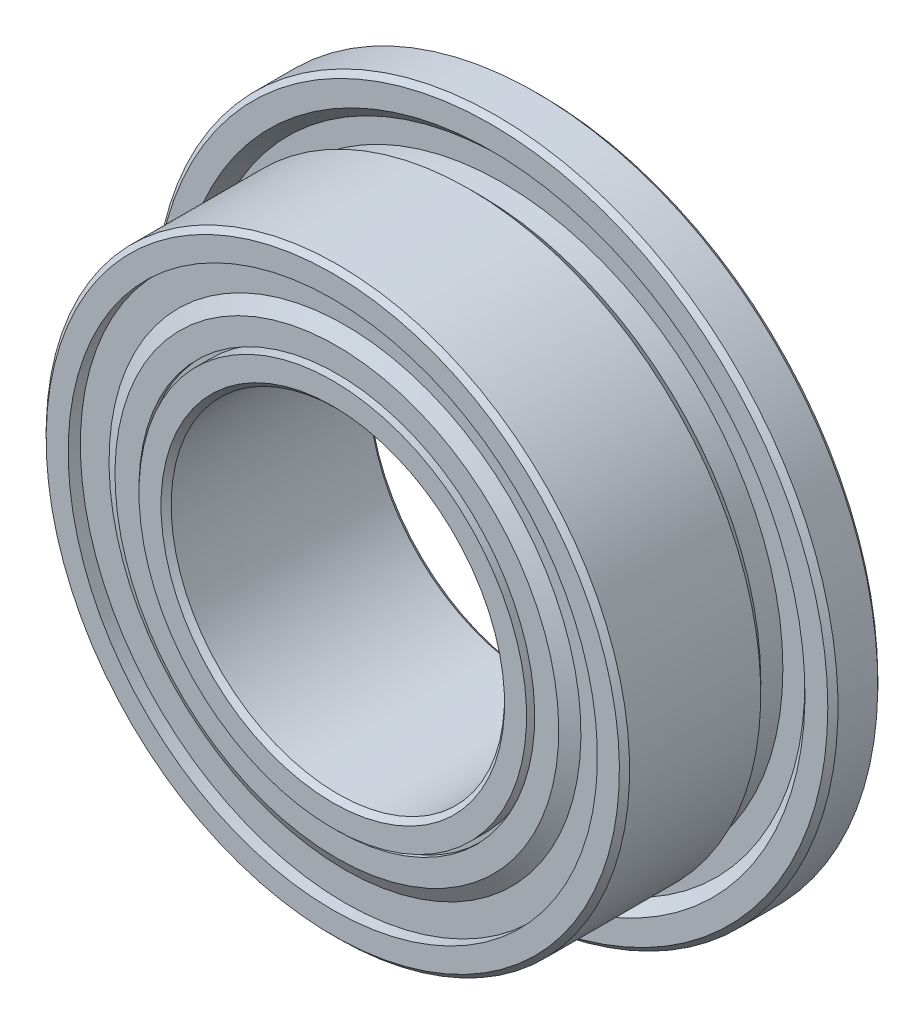
ISO-10303-21;
HEADER;
FILE_DESCRIPTION(('STEP AP214'),'2;1');
FILE_NAME('part.step','',(''),(''),'','','');
FILE_SCHEMA(('AUTOMOTIVE_DESIGN { 1 0 10303 214 1 1 1 1 }'));
ENDSEC;
DATA;
#1=APPLICATION_CONTEXT('core data for automotive mechanical design processes');
#2=APPLICATION_PROTOCOL_DEFINITION('international standard','automotive_design',2000,#1);
#3=PRODUCT_CONTEXT('',#1,'mechanical');
#4=PRODUCT('Part','Part','',(#3));
#5=PRODUCT_RELATED_PRODUCT_CATEGORY('part','',(#4));
#6=PRODUCT_DEFINITION_FORMATION('','',#4);
#7=PRODUCT_DEFINITION_CONTEXT('part definition',#1,'design');
#8=PRODUCT_DEFINITION('design','',#6,#7);
#9=PRODUCT_DEFINITION_SHAPE('','',#8);
#10=(LENGTH_UNIT() NAMED_UNIT(*) SI_UNIT(.MILLI.,.METRE.));
#11=(NAMED_UNIT(*) PLANE_ANGLE_UNIT() SI_UNIT($,.RADIAN.));
#12=(NAMED_UNIT(*) SI_UNIT($,.STERADIAN.) SOLID_ANGLE_UNIT());
#13=UNCERTAINTY_MEASURE_WITH_UNIT(LENGTH_MEASURE(1.E-05),#10,'distance_accuracy_value','');
#14=(GEOMETRIC_REPRESENTATION_CONTEXT(3) GLOBAL_UNCERTAINTY_ASSIGNED_CONTEXT((#13)) GLOBAL_UNIT_ASSIGNED_CONTEXT((#10,
#11,#12)) REPRESENTATION_CONTEXT('',''));
#15=CARTESIAN_POINT('',(0.,0.,0.));
#16=DIRECTION('',(0.,0.,1.));
#17=DIRECTION('',(1.,0.,0.));
#18=AXIS2_PLACEMENT_3D('',#15,#16,#17);
#19=CARTESIAN_POINT('',(0.,0.,0.));
#20=DIRECTION('',(0.,0.,1.));
#21=DIRECTION('',(0.,-1.,0.));
#22=AXIS2_PLACEMENT_3D('',#19,#20,#21);
#23=CYLINDRICAL_SURFACE('',#22,3.175);
#24=CARTESIAN_POINT('',(0.,0.,-1.055));
#25=DIRECTION('',(0.,0.,1.));
#26=DIRECTION('',(0.,-1.,0.));
#27=AXIS2_PLACEMENT_3D('',#24,#25,#26);
#28=CIRCLE('',#27,3.175);
#29=CARTESIAN_POINT('',(0.,-3.175,-1.055));
#30=VERTEX_POINT('',#29);
#31=EDGE_CURVE('E81',#30,#30,#28,.T.);
#32=ORIENTED_EDGE('',*,*,#31,.F.);
#33=EDGE_LOOP('',(#32));
#34=FACE_BOUND('',#33,.T.);
#35=CARTESIAN_POINT('',(0.,0.,-1.10375));
#36=DIRECTION('',(0.,0.,1.));
#37=DIRECTION('',(0.,-1.,0.));
#38=AXIS2_PLACEMENT_3D('',#35,#36,#37);
#39=CIRCLE('',#38,3.175);
#40=CARTESIAN_POINT('',(0.,-3.175,-1.10375));
#41=VERTEX_POINT('',#40);
#42=EDGE_CURVE('E12',#41,#41,#39,.T.);
#43=ORIENTED_EDGE('',*,*,#42,.T.);
#44=EDGE_LOOP('',(#43));
#45=FACE_BOUND('',#44,.T.);
#46=ADVANCED_FACE('F53',(#34,#45),#23,.T.);
#47=CARTESIAN_POINT('',(0.,3.175,-1.10375));
#48=DIRECTION('',(0.,0.,1.));
#49=DIRECTION('',(0.,-1.,0.));
#50=AXIS2_PLACEMENT_3D('',#47,#48,#49);
#51=PLANE('',#50);
#52=ORIENTED_EDGE('',*,*,#42,.F.);
#53=EDGE_LOOP('',(#52));
#54=FACE_BOUND('',#53,.T.);
#55=CARTESIAN_POINT('',(0.,0.,-1.10375));
#56=DIRECTION('',(0.,0.,1.));
#57=DIRECTION('',(0.,-1.,0.));
#58=AXIS2_PLACEMENT_3D('',#55,#56,#57);
#59=CIRCLE('',#58,2.83091966598816);
#60=CARTESIAN_POINT('',(0.,-2.83091966598816,-1.10375));
#61=VERTEX_POINT('',#60);
#62=EDGE_CURVE('E59',#61,#61,#59,.T.);
#63=ORIENTED_EDGE('',*,*,#62,.T.);
#64=EDGE_LOOP('',(#63));
#65=FACE_BOUND('',#64,.T.);
#66=ADVANCED_FACE('F88',(#54,#65),#51,.F.);
#67=CARTESIAN_POINT('',(0.,0.,-1.20125));
#68=DIRECTION('',(0.,0.,1.));
#69=DIRECTION('',(0.,-1.,0.));
#70=AXIS2_PLACEMENT_3D('',#67,#68,#69);
#71=CONICAL_SURFACE('',#70,2.66204471225019,1.0471975511966);
#72=ORIENTED_EDGE('',*,*,#62,.F.);
#73=EDGE_LOOP('',(#72));
#74=FACE_BOUND('',#73,.T.);
#75=CARTESIAN_POINT('',(0.,0.,-1.20125));
#76=DIRECTION('',(0.,0.,1.));
#77=DIRECTION('',(0.,-1.,0.));
#78=AXIS2_PLACEMENT_3D('',#75,#76,#77);
#79=CIRCLE('',#78,2.66204471225019);
#80=CARTESIAN_POINT('',(0.,-2.66204471225019,-1.20125));
#81=VERTEX_POINT('',#80);
#82=EDGE_CURVE('E63',#81,#81,#79,.T.);
#83=ORIENTED_EDGE('',*,*,#82,.T.);
#84=EDGE_LOOP('',(#83));
#85=FACE_BOUND('',#84,.T.);
#86=ADVANCED_FACE('F92',(#74,#85),#71,.T.);
#87=CARTESIAN_POINT('',(0.,2.66204471225019,-1.20125));
#88=DIRECTION('',(0.,0.,1.));
#89=DIRECTION('',(0.,-1.,0.));
#90=AXIS2_PLACEMENT_3D('',#87,#88,#89);
#91=PLANE('',#90);
#92=ORIENTED_EDGE('',*,*,#82,.F.);
#93=EDGE_LOOP('',(#92));
#94=FACE_BOUND('',#93,.T.);
#95=CARTESIAN_POINT('',(0.,0.,-1.20125));
#96=DIRECTION('',(0.,0.,1.));
#97=DIRECTION('',(0.,-1.,0.));
#98=AXIS2_PLACEMENT_3D('',#95,#96,#97);
#99=CIRCLE('',#98,2.37375);
#100=CARTESIAN_POINT('',(0.,-2.37375,-1.20125));
#101=VERTEX_POINT('',#100);
#102=EDGE_CURVE('E67',#101,#101,#99,.T.);
#103=ORIENTED_EDGE('',*,*,#102,.T.);
#104=EDGE_LOOP('',(#103));
#105=FACE_BOUND('',#104,.T.);
#106=ADVANCED_FACE('F97',(#94,#105),#91,.F.);
#107=CARTESIAN_POINT('',(0.,0.,0.));
#108=DIRECTION('',(0.,0.,1.));
#109=DIRECTION('',(0.,-1.,0.));
#110=AXIS2_PLACEMENT_3D('',#107,#108,#109);
#111=CYLINDRICAL_SURFACE('',#110,2.37375);
#112=ORIENTED_EDGE('',*,*,#102,.F.);
#113=EDGE_LOOP('',(#112));
#114=FACE_BOUND('',#113,.T.);
#115=CARTESIAN_POINT('',(0.,0.,-1.1525));
#116=DIRECTION('',(0.,0.,1.));
#117=DIRECTION('',(0.,-1.,0.));
#118=AXIS2_PLACEMENT_3D('',#115,#116,#117);
#119=CIRCLE('',#118,2.37375);
#120=CARTESIAN_POINT('',(0.,-2.37375,-1.1525));
#121=VERTEX_POINT('',#120);
#122=EDGE_CURVE('E72',#121,#121,#119,.T.);
#123=ORIENTED_EDGE('',*,*,#122,.T.);
#124=EDGE_LOOP('',(#123));
#125=FACE_BOUND('',#124,.T.);
#126=ADVANCED_FACE('F103',(#114,#125),#111,.F.);
#127=CARTESIAN_POINT('',(0.,2.64898218911918,-1.1525));
#128=DIRECTION('',(0.,0.,-1.));
#129=DIRECTION('',(0.,1.,0.));
#130=AXIS2_PLACEMENT_3D('',#127,#128,#129);
#131=PLANE('',#130);
#132=ORIENTED_EDGE('',*,*,#122,.F.);
#133=EDGE_LOOP('',(#132));
#134=FACE_BOUND('',#133,.T.);
#135=CARTESIAN_POINT('',(0.,0.,-1.1525));
#136=DIRECTION('',(0.,0.,1.));
#137=DIRECTION('',(0.,-1.,0.));
#138=AXIS2_PLACEMENT_3D('',#135,#136,#137);
#139=CIRCLE('',#138,2.64898218911918);
#140=CARTESIAN_POINT('',(0.,-2.64898218911918,-1.1525));
#141=VERTEX_POINT('',#140);
#142=EDGE_CURVE('E75',#141,#141,#139,.T.);
#143=ORIENTED_EDGE('',*,*,#142,.T.);
#144=EDGE_LOOP('',(#143));
#145=FACE_BOUND('',#144,.T.);
#146=ADVANCED_FACE('F107',(#134,#145),#131,.F.);
#147=CARTESIAN_POINT('',(0.,0.,-1.055));
#148=DIRECTION('',(0.,0.,1.));
#149=DIRECTION('',(0.,-1.,0.));
#150=AXIS2_PLACEMENT_3D('',#147,#148,#149);
#151=CONICAL_SURFACE('',#150,2.81785714285714,1.0471975511966);
#152=ORIENTED_EDGE('',*,*,#142,.F.);
#153=EDGE_LOOP('',(#152));
#154=FACE_BOUND('',#153,.T.);
#155=CARTESIAN_POINT('',(0.,0.,-1.055));
#156=DIRECTION('',(0.,0.,1.));
#157=DIRECTION('',(0.,-1.,0.));
#158=AXIS2_PLACEMENT_3D('',#155,#156,#157);
#159=CIRCLE('',#158,2.81785714285714);
#160=CARTESIAN_POINT('',(0.,-2.81785714285714,-1.055));
#161=VERTEX_POINT('',#160);
#162=EDGE_CURVE('E78',#161,#161,#159,.T.);
#163=ORIENTED_EDGE('',*,*,#162,.T.);
#164=EDGE_LOOP('',(#163));
#165=FACE_BOUND('',#164,.T.);
#166=ADVANCED_FACE('F111',(#154,#165),#151,.F.);
#167=CARTESIAN_POINT('',(0.,3.175,-1.055));
#168=DIRECTION('',(0.,0.,-1.));
#169=DIRECTION('',(0.,1.,0.));
#170=AXIS2_PLACEMENT_3D('',#167,#168,#169);
#171=PLANE('',#170);
#172=ORIENTED_EDGE('',*,*,#162,.F.);
#173=EDGE_LOOP('',(#172));
#174=FACE_BOUND('',#173,.T.);
#175=ORIENTED_EDGE('',*,*,#31,.T.);
#176=EDGE_LOOP('',(#175));
#177=FACE_BOUND('',#176,.T.);
#178=ADVANCED_FACE('F85',(#174,#177),#171,.F.);
#179=CLOSED_SHELL('',(#46,#66,#86,#106,#126,#146,#166,#178));
#180=MANIFOLD_SOLID_BREP('B2',#179);
#181=CARTESIAN_POINT('',(0.,0.,0.));
#182=DIRECTION('',(0.,0.,1.));
#183=DIRECTION('',(0.,-1.,0.));
#184=AXIS2_PLACEMENT_3D('',#181,#182,#183);
#185=CYLINDRICAL_SURFACE('',#184,3.175);
#186=CARTESIAN_POINT('',(0.,0.,1.10375));
#187=DIRECTION('',(0.,0.,1.));
#188=DIRECTION('',(0.,-1.,0.));
#189=AXIS2_PLACEMENT_3D('',#186,#187,#188);
#190=CIRCLE('',#189,3.175);
#191=CARTESIAN_POINT('',(0.,-3.175,1.10375));
#192=VERTEX_POINT('',#191);
#193=EDGE_CURVE('E52',#192,#192,#190,.T.);
#194=ORIENTED_EDGE('',*,*,#193,.F.);
#195=EDGE_LOOP('',(#194));
#196=FACE_BOUND('',#195,.T.);
#197=CARTESIAN_POINT('',(0.,0.,1.055));
#198=DIRECTION('',(0.,0.,1.));
#199=DIRECTION('',(0.,-1.,0.));
#200=AXIS2_PLACEMENT_3D('',#197,#198,#199);
#201=CIRCLE('',#200,3.175);
#202=CARTESIAN_POINT('',(0.,-3.175,1.055));
#203=VERTEX_POINT('',#202);
#204=EDGE_CURVE('E208',#203,#203,#201,.T.);
#205=ORIENTED_EDGE('',*,*,#204,.T.);
#206=EDGE_LOOP('',(#205));
#207=FACE_BOUND('',#206,.T.);
#208=ADVANCED_FACE('F180',(#196,#207),#185,.T.);
#209=CARTESIAN_POINT('',(0.,3.175,1.10375));
#210=DIRECTION('',(0.,0.,-1.));
#211=DIRECTION('',(0.,1.,0.));
#212=AXIS2_PLACEMENT_3D('',#209,#210,#211);
#213=PLANE('',#212);
#214=CARTESIAN_POINT('',(0.,0.,1.10375));
#215=DIRECTION('',(0.,0.,1.));
#216=DIRECTION('',(0.,-1.,0.));
#217=AXIS2_PLACEMENT_3D('',#214,#215,#216);
#218=CIRCLE('',#217,2.83091966598816);
#219=CARTESIAN_POINT('',(0.,-2.83091966598816,1.10375));
#220=VERTEX_POINT('',#219);
#221=EDGE_CURVE('E186',#220,#220,#218,.T.);
#222=ORIENTED_EDGE('',*,*,#221,.F.);
#223=EDGE_LOOP('',(#222));
#224=FACE_BOUND('',#223,.T.);
#225=ORIENTED_EDGE('',*,*,#193,.T.);
#226=EDGE_LOOP('',(#225));
#227=FACE_BOUND('',#226,.T.);
#228=ADVANCED_FACE('F245',(#224,#227),#213,.F.);
#229=CARTESIAN_POINT('',(0.,0.,1.10375));
#230=DIRECTION('',(0.,0.,-1.));
#231=DIRECTION('',(0.,1.,0.));
#232=AXIS2_PLACEMENT_3D('',#229,#230,#231);
#233=CONICAL_SURFACE('',#232,2.83091966598816,1.0471975511966);
#234=CARTESIAN_POINT('',(0.,0.,1.20125));
#235=DIRECTION('',(0.,0.,1.));
#236=DIRECTION('',(0.,-1.,0.));
#237=AXIS2_PLACEMENT_3D('',#234,#235,#236);
#238=CIRCLE('',#237,2.66204471225019);
#239=CARTESIAN_POINT('',(0.,-2.66204471225019,1.20125));
#240=VERTEX_POINT('',#239);
#241=EDGE_CURVE('E190',#240,#240,#238,.T.);
#242=ORIENTED_EDGE('',*,*,#241,.F.);
#243=EDGE_LOOP('',(#242));
#244=FACE_BOUND('',#243,.T.);
#245=ORIENTED_EDGE('',*,*,#221,.T.);
#246=EDGE_LOOP('',(#245));
#247=FACE_BOUND('',#246,.T.);
#248=ADVANCED_FACE('F240',(#244,#247),#233,.T.);
#249=CARTESIAN_POINT('',(0.,2.66204471225019,1.20125));
#250=DIRECTION('',(0.,0.,-1.));
#251=DIRECTION('',(0.,1.,0.));
#252=AXIS2_PLACEMENT_3D('',#249,#250,#251);
#253=PLANE('',#252);
#254=CARTESIAN_POINT('',(0.,0.,1.20125));
#255=DIRECTION('',(0.,0.,1.));
#256=DIRECTION('',(0.,-1.,0.));
#257=AXIS2_PLACEMENT_3D('',#254,#255,#256);
#258=CIRCLE('',#257,2.37375);
#259=CARTESIAN_POINT('',(0.,-2.37375,1.20125));
#260=VERTEX_POINT('',#259);
#261=EDGE_CURVE('E194',#260,#260,#258,.T.);
#262=ORIENTED_EDGE('',*,*,#261,.F.);
#263=EDGE_LOOP('',(#262));
#264=FACE_BOUND('',#263,.T.);
#265=ORIENTED_EDGE('',*,*,#241,.T.);
#266=EDGE_LOOP('',(#265));
#267=FACE_BOUND('',#266,.T.);
#268=ADVANCED_FACE('F234',(#264,#267),#253,.F.);
#269=CARTESIAN_POINT('',(0.,0.,0.));
#270=DIRECTION('',(0.,0.,1.));
#271=DIRECTION('',(0.,-1.,0.));
#272=AXIS2_PLACEMENT_3D('',#269,#270,#271);
#273=CYLINDRICAL_SURFACE('',#272,2.37375);
#274=CARTESIAN_POINT('',(0.,0.,1.1525));
#275=DIRECTION('',(0.,0.,1.));
#276=DIRECTION('',(0.,-1.,0.));
#277=AXIS2_PLACEMENT_3D('',#274,#275,#276);
#278=CIRCLE('',#277,2.37375);
#279=CARTESIAN_POINT('',(0.,-2.37375,1.1525));
#280=VERTEX_POINT('',#279);
#281=EDGE_CURVE('E199',#280,#280,#278,.T.);
#282=ORIENTED_EDGE('',*,*,#281,.F.);
#283=EDGE_LOOP('',(#282));
#284=FACE_BOUND('',#283,.T.);
#285=ORIENTED_EDGE('',*,*,#261,.T.);
#286=EDGE_LOOP('',(#285));
#287=FACE_BOUND('',#286,.T.);
#288=ADVANCED_FACE('F228',(#284,#287),#273,.F.);
#289=CARTESIAN_POINT('',(0.,2.64898218911918,1.1525));
#290=DIRECTION('',(0.,0.,1.));
#291=DIRECTION('',(0.,-1.,0.));
#292=AXIS2_PLACEMENT_3D('',#289,#290,#291);
#293=PLANE('',#292);
#294=CARTESIAN_POINT('',(0.,0.,1.1525));
#295=DIRECTION('',(0.,0.,1.));
#296=DIRECTION('',(0.,-1.,0.));
#297=AXIS2_PLACEMENT_3D('',#294,#295,#296);
#298=CIRCLE('',#297,2.64898218911918);
#299=CARTESIAN_POINT('',(0.,-2.64898218911918,1.1525));
#300=VERTEX_POINT('',#299);
#301=EDGE_CURVE('E202',#300,#300,#298,.T.);
#302=ORIENTED_EDGE('',*,*,#301,.F.);
#303=EDGE_LOOP('',(#302));
#304=FACE_BOUND('',#303,.T.);
#305=ORIENTED_EDGE('',*,*,#281,.T.);
#306=EDGE_LOOP('',(#305));
#307=FACE_BOUND('',#306,.T.);
#308=ADVANCED_FACE('F222',(#304,#307),#293,.F.);
#309=CARTESIAN_POINT('',(0.,0.,1.1525));
#310=DIRECTION('',(0.,0.,-1.));
#311=DIRECTION('',(0.,1.,0.));
#312=AXIS2_PLACEMENT_3D('',#309,#310,#311);
#313=CONICAL_SURFACE('',#312,2.64898218911918,1.0471975511966);
#314=CARTESIAN_POINT('',(0.,0.,1.055));
#315=DIRECTION('',(0.,0.,1.));
#316=DIRECTION('',(0.,-1.,0.));
#317=AXIS2_PLACEMENT_3D('',#314,#315,#316);
#318=CIRCLE('',#317,2.81785714285714);
#319=CARTESIAN_POINT('',(0.,-2.81785714285714,1.055));
#320=VERTEX_POINT('',#319);
#321=EDGE_CURVE('E205',#320,#320,#318,.T.);
#322=ORIENTED_EDGE('',*,*,#321,.F.);
#323=EDGE_LOOP('',(#322));
#324=FACE_BOUND('',#323,.T.);
#325=ORIENTED_EDGE('',*,*,#301,.T.);
#326=EDGE_LOOP('',(#325));
#327=FACE_BOUND('',#326,.T.);
#328=ADVANCED_FACE('F216',(#324,#327),#313,.F.);
#329=CARTESIAN_POINT('',(0.,3.175,1.055));
#330=DIRECTION('',(0.,0.,1.));
#331=DIRECTION('',(0.,-1.,0.));
#332=AXIS2_PLACEMENT_3D('',#329,#330,#331);
#333=PLANE('',#332);
#334=ORIENTED_EDGE('',*,*,#204,.F.);
#335=EDGE_LOOP('',(#334));
#336=FACE_BOUND('',#335,.T.);
#337=ORIENTED_EDGE('',*,*,#321,.T.);
#338=EDGE_LOOP('',(#337));
#339=FACE_BOUND('',#338,.T.);
#340=ADVANCED_FACE('F213',(#336,#339),#333,.F.);
#341=CLOSED_SHELL('',(#208,#228,#248,#268,#288,#308,#328,#340));
#342=MANIFOLD_SOLID_BREP('B7',#341);
#343=CARTESIAN_POINT('',(-1.27798872312033,2.43500407054634,0.));
#344=DIRECTION('',(-0.464723172043757,0.885456025653216,0.));
#345=DIRECTION('',(0.885456025653216,0.464723172043757,0.));
#346=AXIS2_PLACEMENT_3D('',#343,#344,#345);
#347=SPHERICAL_SURFACE('',#346,0.5);
#348=CARTESIAN_POINT('',(-1.51035030914221,2.87773208337295,0.));
#349=VERTEX_POINT('',#348);
#350=VERTEX_LOOP('',#349);
#351=FACE_BOUND('',#350,.T.);
#352=ADVANCED_FACE('F307',(#351),#347,.T.);
#353=CLOSED_SHELL('',(#352));
#354=MANIFOLD_SOLID_BREP('B47',#353);
#355=CARTESIAN_POINT('',(-2.26320563120754,1.56217805351071,0.));
#356=DIRECTION('',(-0.822983865893649,0.568064746731166,0.));
#357=DIRECTION('',(0.568064746731166,0.822983865893649,0.));
#358=AXIS2_PLACEMENT_3D('',#355,#356,#357);
#359=SPHERICAL_SURFACE('',#358,0.5);
#360=CARTESIAN_POINT('',(-2.67469756415436,1.84621042687629,0.));
#361=VERTEX_POINT('',#360);
#362=VERTEX_LOOP('',#361);
#363=FACE_BOUND('',#362,.T.);
#364=ADVANCED_FACE('F325',(#363),#359,.T.);
#365=CLOSED_SHELL('',(#364));
#366=MANIFOLD_SOLID_BREP('B176',#365);
#367=CARTESIAN_POINT('',(-2.72994940376965,0.331475870702168,0.));
#368=DIRECTION('',(-0.992708874098053,0.120536680255334,0.));
#369=DIRECTION('',(0.120536680255334,0.992708874098053,0.));
#370=AXIS2_PLACEMENT_3D('',#367,#368,#369);
#371=SPHERICAL_SURFACE('',#370,0.5);
#372=CARTESIAN_POINT('',(-3.22630384081867,0.391744210829835,0.));
#373=VERTEX_POINT('',#372);
#374=VERTEX_LOOP('',#373);
#375=FACE_BOUND('',#374,.T.);
#376=ADVANCED_FACE('F343',(#375),#371,.T.);
#377=CLOSED_SHELL('',(#376));
#378=MANIFOLD_SOLID_BREP('B303',#377);
#379=CARTESIAN_POINT('',(-2.5712946673849,-0.975163439366949,0.));
#380=DIRECTION('',(-0.935016242685418,-0.354604887042527,0.));
#381=DIRECTION('',(-0.354604887042527,0.935016242685418,0.));
#382=AXIS2_PLACEMENT_3D('',#379,#380,#381);
#383=SPHERICAL_SURFACE('',#382,0.5);
#384=CARTESIAN_POINT('',(-3.03880278872761,-1.15246588288821,0.));
#385=VERTEX_POINT('',#384);
#386=VERTEX_LOOP('',#385);
#387=FACE_BOUND('',#386,.T.);
#388=ADVANCED_FACE('F361',(#387),#383,.T.);
#389=CLOSED_SHELL('',(#388));
#390=MANIFOLD_SOLID_BREP('B321',#389);
#391=CARTESIAN_POINT('',(-1.8235873101622,-2.05840455747051,0.));
#392=DIRECTION('',(-0.663122658240802,-0.748510748171095,0.));
#393=DIRECTION('',(-0.748510748171095,0.663122658240802,0.));
#394=AXIS2_PLACEMENT_3D('',#391,#392,#393);
#395=SPHERICAL_SURFACE('',#394,0.5);
#396=CARTESIAN_POINT('',(-2.15514863928261,-2.43265993155606,0.));
#397=VERTEX_POINT('',#396);
#398=VERTEX_LOOP('',#397);
#399=FACE_BOUND('',#398,.T.);
#400=ADVANCED_FACE('F379',(#399),#395,.T.);
#401=CLOSED_SHELL('',(#400));
#402=MANIFOLD_SOLID_BREP('B339',#401);
#403=CARTESIAN_POINT('',(-0.658118076790804,-2.67008999792164,0.));
#404=DIRECTION('',(-0.239315664287565,-0.97094181742605,0.));
#405=DIRECTION('',(-0.97094181742605,0.239315664287565,0.));
#406=AXIS2_PLACEMENT_3D('',#403,#404,#405);
#407=SPHERICAL_SURFACE('',#406,0.5);
#408=CARTESIAN_POINT('',(-0.777775908934587,-3.15556090663466,0.));
#409=VERTEX_POINT('',#408);
#410=VERTEX_LOOP('',#409);
#411=FACE_BOUND('',#410,.T.);
#412=ADVANCED_FACE('F397',(#411),#407,.T.);
#413=CLOSED_SHELL('',(#412));
#414=MANIFOLD_SOLID_BREP('B357',#413);
#415=CARTESIAN_POINT('',(0.658118076790767,-2.67008999792165,0.));
#416=DIRECTION('',(0.239315664287552,-0.970941817426054,0.));
#417=DIRECTION('',(-0.970941817426054,-0.239315664287552,0.));
#418=AXIS2_PLACEMENT_3D('',#415,#416,#417);
#419=SPHERICAL_SURFACE('',#418,0.5);
#420=CARTESIAN_POINT('',(0.777775908934543,-3.15556090663467,0.));
#421=VERTEX_POINT('',#420);
#422=VERTEX_LOOP('',#421);
#423=FACE_BOUND('',#422,.T.);
#424=ADVANCED_FACE('F415',(#423),#419,.T.);
#425=CLOSED_SHELL('',(#424));
#426=MANIFOLD_SOLID_BREP('B375',#425);
#427=CARTESIAN_POINT('',(1.82358731016218,-2.05840455747054,0.));
#428=DIRECTION('',(0.663122658240791,-0.748510748171105,0.));
#429=DIRECTION('',(-0.748510748171105,-0.663122658240791,0.));
#430=AXIS2_PLACEMENT_3D('',#427,#428,#429);
#431=SPHERICAL_SURFACE('',#430,0.5);
#432=CARTESIAN_POINT('',(2.15514863928257,-2.43265993155609,0.));
#433=VERTEX_POINT('',#432);
#434=VERTEX_LOOP('',#433);
#435=FACE_BOUND('',#434,.T.);
#436=ADVANCED_FACE('F433',(#435),#431,.T.);
#437=CLOSED_SHELL('',(#436));
#438=MANIFOLD_SOLID_BREP('B393',#437);
#439=CARTESIAN_POINT('',(2.57129466738489,-0.975163439366984,0.));
#440=DIRECTION('',(0.935016242685413,-0.35460488704254,0.));
#441=DIRECTION('',(-0.35460488704254,-0.935016242685413,0.));
#442=AXIS2_PLACEMENT_3D('',#439,#440,#441);
#443=SPHERICAL_SURFACE('',#442,0.5);
#444=CARTESIAN_POINT('',(3.03880278872759,-1.15246588288825,0.));
#445=VERTEX_POINT('',#444);
#446=VERTEX_LOOP('',#445);
#447=FACE_BOUND('',#446,.T.);
#448=ADVANCED_FACE('F451',(#447),#443,.T.);
#449=CLOSED_SHELL('',(#448));
#450=MANIFOLD_SOLID_BREP('B411',#449);
#451=CARTESIAN_POINT('',(2.72994940376965,0.33147587070213,0.));
#452=DIRECTION('',(0.992708874098054,0.12053668025532,0.));
#453=DIRECTION('',(0.12053668025532,-0.992708874098054,0.));
#454=AXIS2_PLACEMENT_3D('',#451,#452,#453);
#455=SPHERICAL_SURFACE('',#454,0.5);
#456=CARTESIAN_POINT('',(3.22630384081868,0.39174421082979,0.));
#457=VERTEX_POINT('',#456);
#458=VERTEX_LOOP('',#457);
#459=FACE_BOUND('',#458,.T.);
#460=ADVANCED_FACE('F469',(#459),#455,.T.);
#461=CLOSED_SHELL('',(#460));
#462=MANIFOLD_SOLID_BREP('B429',#461);
#463=CARTESIAN_POINT('',(2.26320563120756,1.56217805351067,0.));
#464=DIRECTION('',(0.822983865893658,0.568064746731154,0.));
#465=DIRECTION('',(0.568064746731154,-0.822983865893658,0.));
#466=AXIS2_PLACEMENT_3D('',#463,#464,#465);
#467=SPHERICAL_SURFACE('',#466,0.5);
#468=CARTESIAN_POINT('',(2.67469756415439,1.84621042687625,0.));
#469=VERTEX_POINT('',#468);
#470=VERTEX_LOOP('',#469);
#471=FACE_BOUND('',#470,.T.);
#472=ADVANCED_FACE('F487',(#471),#467,.T.);
#473=CLOSED_SHELL('',(#472));
#474=MANIFOLD_SOLID_BREP('B447',#473);
#475=CARTESIAN_POINT('',(1.27798872312037,2.43500407054633,0.));
#476=DIRECTION('',(0.464723172043769,0.885456025653209,0.));
#477=DIRECTION('',(0.885456025653209,-0.464723172043769,0.));
#478=AXIS2_PLACEMENT_3D('',#475,#476,#477);
#479=SPHERICAL_SURFACE('',#478,0.5);
#480=CARTESIAN_POINT('',(1.51035030914225,2.87773208337293,0.));
#481=VERTEX_POINT('',#480);
#482=VERTEX_LOOP('',#481);
#483=FACE_BOUND('',#482,.T.);
#484=ADVANCED_FACE('F505',(#483),#479,.T.);
#485=CLOSED_SHELL('',(#484));
#486=MANIFOLD_SOLID_BREP('B465',#485);
#487=CARTESIAN_POINT('',(0.,2.75,0.));
#488=DIRECTION('',(0.,1.,0.));
#489=DIRECTION('',(1.,0.,0.));
#490=AXIS2_PLACEMENT_3D('',#487,#488,#489);
#491=SPHERICAL_SURFACE('',#490,0.5);
#492=CARTESIAN_POINT('',(0.,3.25,0.));
#493=VERTEX_POINT('',#492);
#494=VERTEX_LOOP('',#493);
#495=FACE_BOUND('',#494,.T.);
#496=ADVANCED_FACE('F526',(#495),#491,.T.);
#497=CLOSED_SHELL('',(#496));
#498=MANIFOLD_SOLID_BREP('B483',#497);
#499=CARTESIAN_POINT('',(0.,0.,0.));
#500=DIRECTION('',(0.,0.,1.));
#501=DIRECTION('',(0.,-1.,0.));
#502=AXIS2_PLACEMENT_3D('',#499,#500,#501);
#503=CYLINDRICAL_SURFACE('',#502,2.4875);
#504=CARTESIAN_POINT('',(0.,0.,0.42555111326373));
#505=DIRECTION('',(0.,0.,1.));
#506=DIRECTION('',(0.,-1.,0.));
#507=AXIS2_PLACEMENT_3D('',#504,#505,#506);
#508=CIRCLE('',#507,2.4875);
#509=CARTESIAN_POINT('',(0.,-2.4875,0.42555111326373));
#510=VERTEX_POINT('',#509);
#511=EDGE_CURVE('E570',#510,#510,#508,.T.);
#512=ORIENTED_EDGE('',*,*,#511,.T.);
#513=EDGE_LOOP('',(#512));
#514=FACE_BOUND('',#513,.T.);
#515=CARTESIAN_POINT('',(0.,0.,1.055));
#516=DIRECTION('',(0.,0.,1.));
#517=DIRECTION('',(0.,-1.,0.));
#518=AXIS2_PLACEMENT_3D('',#515,#516,#517);
#519=CIRCLE('',#518,2.4875);
#520=CARTESIAN_POINT('',(0.,-2.4875,1.055));
#521=VERTEX_POINT('',#520);
#522=EDGE_CURVE('E588',#521,#521,#519,.T.);
#523=ORIENTED_EDGE('',*,*,#522,.F.);
#524=EDGE_LOOP('',(#523));
#525=FACE_BOUND('',#524,.T.);
#526=ADVANCED_FACE('F547',(#514,#525),#503,.T.);
#527=CARTESIAN_POINT('',(0.,2.,1.25));
#528=DIRECTION('',(0.,0.,-1.));
#529=DIRECTION('',(0.,1.,0.));
#530=AXIS2_PLACEMENT_3D('',#527,#528,#529);
#531=PLANE('',#530);
#532=CARTESIAN_POINT('',(0.,0.,1.25));
#533=DIRECTION('',(0.,0.,-1.));
#534=DIRECTION('',(0.,1.,0.));
#535=AXIS2_PLACEMENT_3D('',#532,#533,#534);
#536=CIRCLE('',#535,2.0609375);
#537=CARTESIAN_POINT('',(0.,2.0609375,1.25));
#538=VERTEX_POINT('',#537);
#539=EDGE_CURVE('E525',#538,#538,#536,.T.);
#540=ORIENTED_EDGE('',*,*,#539,.T.);
#541=EDGE_LOOP('',(#540));
#542=FACE_BOUND('',#541,.T.);
#543=CARTESIAN_POINT('',(0.,0.,1.25));
#544=DIRECTION('',(0.,0.,1.));
#545=DIRECTION('',(0.,-1.,0.));
#546=AXIS2_PLACEMENT_3D('',#543,#544,#545);
#547=CIRCLE('',#546,2.325);
#548=CARTESIAN_POINT('',(0.,-2.325,1.25));
#549=VERTEX_POINT('',#548);
#550=EDGE_CURVE('E582',#549,#549,#547,.T.);
#551=ORIENTED_EDGE('',*,*,#550,.T.);
#552=EDGE_LOOP('',(#551));
#553=FACE_BOUND('',#552,.T.);
#554=ADVANCED_FACE('F596',(#542,#553),#531,.F.);
#555=CARTESIAN_POINT('',(0.,0.,0.));
#556=DIRECTION('',(0.,0.,1.));
#557=DIRECTION('',(0.,-1.,0.));
#558=AXIS2_PLACEMENT_3D('',#555,#556,#557);
#559=CYLINDRICAL_SURFACE('',#558,2.4875);
#560=CARTESIAN_POINT('',(0.,0.,-0.425551113263731));
#561=DIRECTION('',(0.,0.,1.));
#562=DIRECTION('',(0.,-1.,0.));
#563=AXIS2_PLACEMENT_3D('',#560,#561,#562);
#564=CIRCLE('',#563,2.4875);
#565=CARTESIAN_POINT('',(0.,-2.4875,-0.425551113263731));
#566=VERTEX_POINT('',#565);
#567=EDGE_CURVE('E567',#566,#566,#564,.T.);
#568=ORIENTED_EDGE('',*,*,#567,.F.);
#569=EDGE_LOOP('',(#568));
#570=FACE_BOUND('',#569,.T.);
#571=CARTESIAN_POINT('',(0.,0.,-1.055));
#572=DIRECTION('',(0.,0.,1.));
#573=DIRECTION('',(0.,-1.,0.));
#574=AXIS2_PLACEMENT_3D('',#571,#572,#573);
#575=CIRCLE('',#574,2.4875);
#576=CARTESIAN_POINT('',(0.,-2.4875,-1.055));
#577=VERTEX_POINT('',#576);
#578=EDGE_CURVE('E579',#577,#577,#575,.T.);
#579=ORIENTED_EDGE('',*,*,#578,.T.);
#580=EDGE_LOOP('',(#579));
#581=FACE_BOUND('',#580,.T.);
#582=ADVANCED_FACE('F602',(#570,#581),#559,.T.);
#583=CARTESIAN_POINT('',(0.,2.4875,-1.25));
#584=DIRECTION('',(0.,0.,1.));
#585=DIRECTION('',(0.,-1.,0.));
#586=AXIS2_PLACEMENT_3D('',#583,#584,#585);
#587=PLANE('',#586);
#588=CARTESIAN_POINT('',(0.,0.,-1.25));
#589=DIRECTION('',(0.,0.,1.));
#590=DIRECTION('',(0.,-1.,0.));
#591=AXIS2_PLACEMENT_3D('',#588,#589,#590);
#592=CIRCLE('',#591,2.0609375);
#593=CARTESIAN_POINT('',(0.,-2.0609375,-1.25));
#594=VERTEX_POINT('',#593);
#595=EDGE_CURVE('E562',#594,#594,#592,.T.);
#596=ORIENTED_EDGE('',*,*,#595,.T.);
#597=EDGE_LOOP('',(#596));
#598=FACE_BOUND('',#597,.T.);
#599=CARTESIAN_POINT('',(0.,0.,-1.25));
#600=DIRECTION('',(0.,0.,1.));
#601=DIRECTION('',(0.,-1.,0.));
#602=AXIS2_PLACEMENT_3D('',#599,#600,#601);
#603=CIRCLE('',#602,2.325);
#604=CARTESIAN_POINT('',(0.,-2.325,-1.25));
#605=VERTEX_POINT('',#604);
#606=EDGE_CURVE('E573',#605,#605,#603,.T.);
#607=ORIENTED_EDGE('',*,*,#606,.F.);
#608=EDGE_LOOP('',(#607));
#609=FACE_BOUND('',#608,.T.);
#610=ADVANCED_FACE('F610',(#598,#609),#587,.F.);
#611=CARTESIAN_POINT('',(0.,0.,0.));
#612=DIRECTION('',(0.,0.,1.));
#613=DIRECTION('',(0.,-1.,0.));
#614=AXIS2_PLACEMENT_3D('',#611,#612,#613);
#615=TOROIDAL_SURFACE('',#614,2.75,0.5);
#616=ORIENTED_EDGE('',*,*,#511,.F.);
#617=EDGE_LOOP('',(#616));
#618=FACE_BOUND('',#617,.T.);
#619=ORIENTED_EDGE('',*,*,#567,.T.);
#620=EDGE_LOOP('',(#619));
#621=FACE_BOUND('',#620,.T.);
#622=ADVANCED_FACE('F606',(#618,#621),#615,.F.);
#623=CARTESIAN_POINT('',(0.,0.,0.));
#624=DIRECTION('',(0.,0.,1.));
#625=DIRECTION('',(0.,-1.,0.));
#626=AXIS2_PLACEMENT_3D('',#623,#624,#625);
#627=CYLINDRICAL_SURFACE('',#626,2.);
#628=CARTESIAN_POINT('',(0.,0.,-1.1890625));
#629=DIRECTION('',(0.,0.,1.));
#630=DIRECTION('',(0.,-1.,0.));
#631=AXIS2_PLACEMENT_3D('',#628,#629,#630);
#632=CIRCLE('',#631,2.);
#633=CARTESIAN_POINT('',(0.,-2.,-1.1890625));
#634=VERTEX_POINT('',#633);
#635=EDGE_CURVE('E554',#634,#634,#632,.F.);
#636=ORIENTED_EDGE('',*,*,#635,.T.);
#637=EDGE_LOOP('',(#636));
#638=FACE_BOUND('',#637,.T.);
#639=CARTESIAN_POINT('',(0.,0.,1.1890625));
#640=DIRECTION('',(0.,0.,-1.));
#641=DIRECTION('',(0.,1.,0.));
#642=AXIS2_PLACEMENT_3D('',#639,#640,#641);
#643=CIRCLE('',#642,2.);
#644=CARTESIAN_POINT('',(0.,2.,1.1890625));
#645=VERTEX_POINT('',#644);
#646=EDGE_CURVE('E558',#645,#645,#643,.F.);
#647=ORIENTED_EDGE('',*,*,#646,.T.);
#648=EDGE_LOOP('',(#647));
#649=FACE_BOUND('',#648,.T.);
#650=ADVANCED_FACE('F609',(#638,#649),#627,.F.);
#651=CARTESIAN_POINT('',(0.,0.,-1.25));
#652=DIRECTION('',(0.,0.,-1.));
#653=DIRECTION('',(0.,1.,0.));
#654=AXIS2_PLACEMENT_3D('',#651,#652,#653);
#655=CONICAL_SURFACE('',#654,2.0609375,0.785398163397448);
#656=ORIENTED_EDGE('',*,*,#635,.F.);
#657=EDGE_LOOP('',(#656));
#658=FACE_BOUND('',#657,.T.);
#659=ORIENTED_EDGE('',*,*,#595,.F.);
#660=EDGE_LOOP('',(#659));
#661=FACE_BOUND('',#660,.T.);
#662=ADVANCED_FACE('F614',(#658,#661),#655,.F.);
#663=CARTESIAN_POINT('',(0.,0.,1.1890625));
#664=DIRECTION('',(0.,0.,1.));
#665=DIRECTION('',(0.,-1.,0.));
#666=AXIS2_PLACEMENT_3D('',#663,#664,#665);
#667=CONICAL_SURFACE('',#666,2.,0.785398163397448);
#668=ORIENTED_EDGE('',*,*,#539,.F.);
#669=EDGE_LOOP('',(#668));
#670=FACE_BOUND('',#669,.T.);
#671=ORIENTED_EDGE('',*,*,#646,.F.);
#672=EDGE_LOOP('',(#671));
#673=FACE_BOUND('',#672,.T.);
#674=ADVANCED_FACE('F549',(#670,#673),#667,.F.);
#675=CARTESIAN_POINT('',(0.,0.,0.));
#676=DIRECTION('',(0.,0.,1.));
#677=DIRECTION('',(0.,-1.,0.));
#678=AXIS2_PLACEMENT_3D('',#675,#676,#677);
#679=CYLINDRICAL_SURFACE('',#678,2.325);
#680=ORIENTED_EDGE('',*,*,#606,.T.);
#681=EDGE_LOOP('',(#680));
#682=FACE_BOUND('',#681,.T.);
#683=CARTESIAN_POINT('',(0.,0.,-1.055));
#684=DIRECTION('',(0.,0.,1.));
#685=DIRECTION('',(0.,-1.,0.));
#686=AXIS2_PLACEMENT_3D('',#683,#684,#685);
#687=CIRCLE('',#686,2.325);
#688=CARTESIAN_POINT('',(0.,-2.325,-1.055));
#689=VERTEX_POINT('',#688);
#690=EDGE_CURVE('E576',#689,#689,#687,.T.);
#691=ORIENTED_EDGE('',*,*,#690,.F.);
#692=EDGE_LOOP('',(#691));
#693=FACE_BOUND('',#692,.T.);
#694=ADVANCED_FACE('F621',(#682,#693),#679,.T.);
#695=CARTESIAN_POINT('',(0.,2.4875,-1.055));
#696=DIRECTION('',(0.,0.,-1.));
#697=DIRECTION('',(0.,1.,0.));
#698=AXIS2_PLACEMENT_3D('',#695,#696,#697);
#699=PLANE('',#698);
#700=ORIENTED_EDGE('',*,*,#690,.T.);
#701=EDGE_LOOP('',(#700));
#702=FACE_BOUND('',#701,.T.);
#703=ORIENTED_EDGE('',*,*,#578,.F.);
#704=EDGE_LOOP('',(#703));
#705=FACE_BOUND('',#704,.T.);
#706=ADVANCED_FACE('F633',(#702,#705),#699,.T.);
#707=CARTESIAN_POINT('',(0.,0.,0.));
#708=DIRECTION('',(0.,0.,1.));
#709=DIRECTION('',(0.,-1.,0.));
#710=AXIS2_PLACEMENT_3D('',#707,#708,#709);
#711=CYLINDRICAL_SURFACE('',#710,2.325);
#712=CARTESIAN_POINT('',(0.,0.,1.055));
#713=DIRECTION('',(0.,0.,1.));
#714=DIRECTION('',(0.,-1.,0.));
#715=AXIS2_PLACEMENT_3D('',#712,#713,#714);
#716=CIRCLE('',#715,2.325);
#717=CARTESIAN_POINT('',(0.,-2.325,1.055));
#718=VERTEX_POINT('',#717);
#719=EDGE_CURVE('E585',#718,#718,#716,.T.);
#720=ORIENTED_EDGE('',*,*,#719,.T.);
#721=EDGE_LOOP('',(#720));
#722=FACE_BOUND('',#721,.T.);
#723=ORIENTED_EDGE('',*,*,#550,.F.);
#724=EDGE_LOOP('',(#723));
#725=FACE_BOUND('',#724,.T.);
#726=ADVANCED_FACE('F639',(#722,#725),#711,.T.);
#727=CARTESIAN_POINT('',(0.,2.4875,1.055));
#728=DIRECTION('',(0.,0.,1.));
#729=DIRECTION('',(0.,-1.,0.));
#730=AXIS2_PLACEMENT_3D('',#727,#728,#729);
#731=PLANE('',#730);
#732=ORIENTED_EDGE('',*,*,#522,.T.);
#733=EDGE_LOOP('',(#732));
#734=FACE_BOUND('',#733,.T.);
#735=ORIENTED_EDGE('',*,*,#719,.F.);
#736=EDGE_LOOP('',(#735));
#737=FACE_BOUND('',#736,.T.);
#738=ADVANCED_FACE('F592',(#734,#737),#731,.T.);
#739=CLOSED_SHELL('',(#526,#554,#582,#610,#622,#650,#662,#674,#694,#706,#726,#738));
#740=MANIFOLD_SOLID_BREP('B501',#739);
#741=CARTESIAN_POINT('',(0.,3.0125,-1.25));
#742=DIRECTION('',(0.,0.,1.));
#743=DIRECTION('',(0.,-1.,0.));
#744=AXIS2_PLACEMENT_3D('',#741,#742,#743);
#745=PLANE('',#744);
#746=CARTESIAN_POINT('',(0.,0.,-1.25));
#747=DIRECTION('',(0.,0.,1.));
#748=DIRECTION('',(0.,-1.,0.));
#749=AXIS2_PLACEMENT_3D('',#746,#747,#748);
#750=CIRCLE('',#749,4.0390625);
#751=CARTESIAN_POINT('',(0.,-4.0390625,-1.25));
#752=VERTEX_POINT('',#751);
#753=EDGE_CURVE('E747',#752,#752,#750,.F.);
#754=ORIENTED_EDGE('',*,*,#753,.T.);
#755=EDGE_LOOP('',(#754));
#756=FACE_BOUND('',#755,.T.);
#757=CARTESIAN_POINT('',(0.,0.,-1.25));
#758=DIRECTION('',(0.,0.,1.));
#759=DIRECTION('',(0.,-1.,0.));
#760=AXIS2_PLACEMENT_3D('',#757,#758,#759);
#761=CIRCLE('',#760,3.175);
#762=CARTESIAN_POINT('',(0.,-3.175,-1.25));
#763=VERTEX_POINT('',#762);
#764=EDGE_CURVE('E801',#763,#763,#761,.T.);
#765=ORIENTED_EDGE('',*,*,#764,.T.);
#766=EDGE_LOOP('',(#765));
#767=FACE_BOUND('',#766,.T.);
#768=ADVANCED_FACE('F729',(#756,#767),#745,.F.);
#769=CARTESIAN_POINT('',(0.,0.,0.));
#770=DIRECTION('',(0.,0.,1.));
#771=DIRECTION('',(0.,-1.,0.));
#772=AXIS2_PLACEMENT_3D('',#769,#770,#771);
#773=CYLINDRICAL_SURFACE('',#772,3.0125);
#774=CARTESIAN_POINT('',(0.,0.,-0.425551113263731));
#775=DIRECTION('',(0.,0.,1.));
#776=DIRECTION('',(0.,-1.,0.));
#777=AXIS2_PLACEMENT_3D('',#774,#775,#776);
#778=CIRCLE('',#777,3.0125);
#779=CARTESIAN_POINT('',(0.,-3.0125,-0.425551113263731));
#780=VERTEX_POINT('',#779);
#781=EDGE_CURVE('E761',#780,#780,#778,.T.);
#782=ORIENTED_EDGE('',*,*,#781,.T.);
#783=EDGE_LOOP('',(#782));
#784=FACE_BOUND('',#783,.T.);
#785=CARTESIAN_POINT('',(0.,0.,-1.055));
#786=DIRECTION('',(0.,0.,1.));
#787=DIRECTION('',(0.,-1.,0.));
#788=AXIS2_PLACEMENT_3D('',#785,#786,#787);
#789=CIRCLE('',#788,3.0125);
#790=CARTESIAN_POINT('',(0.,-3.0125,-1.055));
#791=VERTEX_POINT('',#790);
#792=EDGE_CURVE('E809',#791,#791,#789,.T.);
#793=ORIENTED_EDGE('',*,*,#792,.F.);
#794=EDGE_LOOP('',(#793));
#795=FACE_BOUND('',#794,.T.);
#796=ADVANCED_FACE('F817',(#784,#795),#773,.F.);
#797=CARTESIAN_POINT('',(0.,0.,0.));
#798=DIRECTION('',(0.,0.,1.));
#799=DIRECTION('',(0.,-1.,0.));
#800=AXIS2_PLACEMENT_3D('',#797,#798,#799);
#801=CYLINDRICAL_SURFACE('',#800,3.0125);
#802=CARTESIAN_POINT('',(0.,0.,0.42555111326373));
#803=DIRECTION('',(0.,0.,1.));
#804=DIRECTION('',(0.,-1.,0.));
#805=AXIS2_PLACEMENT_3D('',#802,#803,#804);
#806=CIRCLE('',#805,3.0125);
#807=CARTESIAN_POINT('',(0.,-3.0125,0.42555111326373));
#808=VERTEX_POINT('',#807);
#809=EDGE_CURVE('E765',#808,#808,#806,.T.);
#810=ORIENTED_EDGE('',*,*,#809,.F.);
#811=EDGE_LOOP('',(#810));
#812=FACE_BOUND('',#811,.T.);
#813=CARTESIAN_POINT('',(0.,0.,1.055));
#814=DIRECTION('',(0.,0.,1.));
#815=DIRECTION('',(0.,-1.,0.));
#816=AXIS2_PLACEMENT_3D('',#813,#814,#815);
#817=CIRCLE('',#816,3.0125);
#818=CARTESIAN_POINT('',(0.,-3.0125,1.055));
#819=VERTEX_POINT('',#818);
#820=EDGE_CURVE('E797',#819,#819,#817,.T.);
#821=ORIENTED_EDGE('',*,*,#820,.T.);
#822=EDGE_LOOP('',(#821));
#823=FACE_BOUND('',#822,.T.);
#824=ADVANCED_FACE('F819',(#812,#823),#801,.F.);
#825=CARTESIAN_POINT('',(0.,3.5,1.25));
#826=DIRECTION('',(0.,0.,-1.));
#827=DIRECTION('',(0.,1.,0.));
#828=AXIS2_PLACEMENT_3D('',#825,#826,#827);
#829=PLANE('',#828);
#830=CARTESIAN_POINT('',(0.,0.,1.25));
#831=DIRECTION('',(0.,0.,-1.));
#832=DIRECTION('',(0.,1.,0.));
#833=AXIS2_PLACEMENT_3D('',#830,#831,#832);
#834=CIRCLE('',#833,3.4390625);
#835=CARTESIAN_POINT('',(0.,3.4390625,1.25));
#836=VERTEX_POINT('',#835);
#837=EDGE_CURVE('E737',#836,#836,#834,.F.);
#838=ORIENTED_EDGE('',*,*,#837,.T.);
#839=EDGE_LOOP('',(#838));
#840=FACE_BOUND('',#839,.T.);
#841=CARTESIAN_POINT('',(0.,0.,1.25));
#842=DIRECTION('',(0.,0.,1.));
#843=DIRECTION('',(0.,-1.,0.));
#844=AXIS2_PLACEMENT_3D('',#841,#842,#843);
#845=CIRCLE('',#844,3.175);
#846=CARTESIAN_POINT('',(0.,-3.175,1.25));
#847=VERTEX_POINT('',#846);
#848=EDGE_CURVE('E789',#847,#847,#845,.T.);
#849=ORIENTED_EDGE('',*,*,#848,.F.);
#850=EDGE_LOOP('',(#849));
#851=FACE_BOUND('',#850,.T.);
#852=ADVANCED_FACE('F826',(#840,#851),#829,.F.);
#853=CARTESIAN_POINT('',(0.,0.,0.));
#854=DIRECTION('',(0.,0.,1.));
#855=DIRECTION('',(0.,-1.,0.));
#856=AXIS2_PLACEMENT_3D('',#853,#854,#855);
#857=TOROIDAL_SURFACE('',#856,2.75,0.5);
#858=ORIENTED_EDGE('',*,*,#781,.F.);
#859=EDGE_LOOP('',(#858));
#860=FACE_BOUND('',#859,.T.);
#861=ORIENTED_EDGE('',*,*,#809,.T.);
#862=EDGE_LOOP('',(#861));
#863=FACE_BOUND('',#862,.T.);
#864=ADVANCED_FACE('F832',(#860,#863),#857,.F.);
#865=CARTESIAN_POINT('',(0.,0.,0.));
#866=DIRECTION('',(0.,0.,1.));
#867=DIRECTION('',(0.,-1.,0.));
#868=AXIS2_PLACEMENT_3D('',#865,#866,#867);
#869=CYLINDRICAL_SURFACE('',#868,3.5);
#870=CARTESIAN_POINT('',(0.,0.,1.1890625));
#871=DIRECTION('',(0.,0.,-1.));
#872=DIRECTION('',(0.,1.,0.));
#873=AXIS2_PLACEMENT_3D('',#870,#871,#872);
#874=CIRCLE('',#873,3.5);
#875=CARTESIAN_POINT('',(0.,3.5,1.1890625));
#876=VERTEX_POINT('',#875);
#877=EDGE_CURVE('E546',#876,#876,#874,.T.);
#878=ORIENTED_EDGE('',*,*,#877,.T.);
#879=EDGE_LOOP('',(#878));
#880=FACE_BOUND('',#879,.T.);
#881=CARTESIAN_POINT('',(0.,0.,-0.384834957055046));
#882=DIRECTION('',(0.,0.,1.));
#883=DIRECTION('',(0.,-1.,0.));
#884=AXIS2_PLACEMENT_3D('',#881,#882,#883);
#885=CIRCLE('',#884,3.5);
#886=CARTESIAN_POINT('',(0.,-3.5,-0.384834957055047));
#887=VERTEX_POINT('',#886);
#888=EDGE_CURVE('E769',#887,#887,#885,.T.);
#889=ORIENTED_EDGE('',*,*,#888,.T.);
#890=EDGE_LOOP('',(#889));
#891=FACE_BOUND('',#890,.T.);
#892=ADVANCED_FACE('F876',(#880,#891),#869,.T.);
#893=CARTESIAN_POINT('',(0.,0.,-0.517417478527524));
#894=DIRECTION('',(0.,0.,1.));
#895=DIRECTION('',(0.,-1.,0.));
#896=AXIS2_PLACEMENT_3D('',#893,#894,#895);
#897=CONICAL_SURFACE('',#896,3.36741747852752,0.785398163397447);
#898=ORIENTED_EDGE('',*,*,#888,.F.);
#899=EDGE_LOOP('',(#898));
#900=FACE_BOUND('',#899,.T.);
#901=CARTESIAN_POINT('',(0.,0.,-0.517417478527524));
#902=DIRECTION('',(0.,0.,1.));
#903=DIRECTION('',(0.,-1.,0.));
#904=AXIS2_PLACEMENT_3D('',#901,#902,#903);
#905=CIRCLE('',#904,3.36741747852752);
#906=CARTESIAN_POINT('',(0.,-3.36741747852752,-0.517417478527524));
#907=VERTEX_POINT('',#906);
#908=EDGE_CURVE('E773',#907,#907,#905,.T.);
#909=ORIENTED_EDGE('',*,*,#908,.T.);
#910=EDGE_LOOP('',(#909));
#911=FACE_BOUND('',#910,.T.);
#912=ADVANCED_FACE('F872',(#900,#911),#897,.T.);
#913=CARTESIAN_POINT('',(0.,0.,0.));
#914=DIRECTION('',(0.,0.,1.));
#915=DIRECTION('',(0.,-1.,0.));
#916=AXIS2_PLACEMENT_3D('',#913,#914,#915);
#917=CYLINDRICAL_SURFACE('',#916,3.36741747852752);
#918=ORIENTED_EDGE('',*,*,#908,.F.);
#919=EDGE_LOOP('',(#918));
#920=FACE_BOUND('',#919,.T.);
#921=CARTESIAN_POINT('',(0.,0.,-0.782582521472479));
#922=DIRECTION('',(0.,0.,1.));
#923=DIRECTION('',(0.,-1.,0.));
#924=AXIS2_PLACEMENT_3D('',#921,#922,#923);
#925=CIRCLE('',#924,3.36741747852752);
#926=CARTESIAN_POINT('',(0.,-3.36741747852752,-0.78258252147248));
#927=VERTEX_POINT('',#926);
#928=EDGE_CURVE('E777',#927,#927,#925,.T.);
#929=ORIENTED_EDGE('',*,*,#928,.T.);
#930=EDGE_LOOP('',(#929));
#931=FACE_BOUND('',#930,.T.);
#932=ADVANCED_FACE('F864',(#920,#931),#917,.T.);
#933=CARTESIAN_POINT('',(0.,3.63258252147248,-0.782582521472479));
#934=DIRECTION('',(0.,0.,-1.));
#935=DIRECTION('',(0.,1.,0.));
#936=AXIS2_PLACEMENT_3D('',#933,#934,#935);
#937=PLANE('',#936);
#938=ORIENTED_EDGE('',*,*,#928,.F.);
#939=EDGE_LOOP('',(#938));
#940=FACE_BOUND('',#939,.T.);
#941=CARTESIAN_POINT('',(0.,0.,-0.782582521472479));
#942=DIRECTION('',(0.,0.,1.));
#943=DIRECTION('',(0.,-1.,0.));
#944=AXIS2_PLACEMENT_3D('',#941,#942,#943);
#945=CIRCLE('',#944,3.63258252147248);
#946=CARTESIAN_POINT('',(0.,-3.63258252147248,-0.78258252147248));
#947=VERTEX_POINT('',#946);
#948=EDGE_CURVE('E781',#947,#947,#945,.T.);
#949=ORIENTED_EDGE('',*,*,#948,.T.);
#950=EDGE_LOOP('',(#949));
#951=FACE_BOUND('',#950,.T.);
#952=ADVANCED_FACE('F858',(#940,#951),#937,.F.);
#953=CARTESIAN_POINT('',(0.,0.,-0.650000000000002));
#954=DIRECTION('',(0.,0.,1.));
#955=DIRECTION('',(0.,-1.,0.));
#956=AXIS2_PLACEMENT_3D('',#953,#954,#955);
#957=CONICAL_SURFACE('',#956,3.76516504294495,0.785398163397444);
#958=ORIENTED_EDGE('',*,*,#948,.F.);
#959=EDGE_LOOP('',(#958));
#960=FACE_BOUND('',#959,.T.);
#961=CARTESIAN_POINT('',(0.,0.,-0.650000000000002));
#962=DIRECTION('',(0.,0.,1.));
#963=DIRECTION('',(0.,-1.,0.));
#964=AXIS2_PLACEMENT_3D('',#961,#962,#963);
#965=CIRCLE('',#964,3.76516504294495);
#966=CARTESIAN_POINT('',(0.,-3.76516504294495,-0.650000000000003));
#967=VERTEX_POINT('',#966);
#968=EDGE_CURVE('E785',#967,#967,#965,.T.);
#969=ORIENTED_EDGE('',*,*,#968,.T.);
#970=EDGE_LOOP('',(#969));
#971=FACE_BOUND('',#970,.T.);
#972=ADVANCED_FACE('F853',(#960,#971),#957,.F.);
#973=CARTESIAN_POINT('',(0.,4.1,-0.650000000000002));
#974=DIRECTION('',(0.,0.,-1.));
#975=DIRECTION('',(0.,1.,0.));
#976=AXIS2_PLACEMENT_3D('',#973,#974,#975);
#977=PLANE('',#976);
#978=CARTESIAN_POINT('',(0.,0.,-0.650000000000002));
#979=DIRECTION('',(0.,0.,-1.));
#980=DIRECTION('',(0.,1.,0.));
#981=AXIS2_PLACEMENT_3D('',#978,#979,#980);
#982=CIRCLE('',#981,4.0390625);
#983=CARTESIAN_POINT('',(0.,4.0390625,-0.650000000000002));
#984=VERTEX_POINT('',#983);
#985=EDGE_CURVE('E742',#984,#984,#982,.F.);
#986=ORIENTED_EDGE('',*,*,#985,.T.);
#987=EDGE_LOOP('',(#986));
#988=FACE_BOUND('',#987,.T.);
#989=ORIENTED_EDGE('',*,*,#968,.F.);
#990=EDGE_LOOP('',(#989));
#991=FACE_BOUND('',#990,.T.);
#992=ADVANCED_FACE('F850',(#988,#991),#977,.F.);
#993=CARTESIAN_POINT('',(0.,0.,0.));
#994=DIRECTION('',(0.,0.,1.));
#995=DIRECTION('',(0.,-1.,0.));
#996=AXIS2_PLACEMENT_3D('',#993,#994,#995);
#997=CYLINDRICAL_SURFACE('',#996,4.1);
#998=CARTESIAN_POINT('',(0.,0.,-1.1890625));
#999=DIRECTION('',(0.,0.,1.));
#1000=DIRECTION('',(0.,-1.,0.));
#1001=AXIS2_PLACEMENT_3D('',#998,#999,#1000);
#1002=CIRCLE('',#1001,4.1);
#1003=CARTESIAN_POINT('',(0.,-4.1,-1.1890625));
#1004=VERTEX_POINT('',#1003);
#1005=EDGE_CURVE('E753',#1004,#1004,#1002,.T.);
#1006=ORIENTED_EDGE('',*,*,#1005,.T.);
#1007=EDGE_LOOP('',(#1006));
#1008=FACE_BOUND('',#1007,.T.);
#1009=CARTESIAN_POINT('',(0.,0.,-0.710937500000002));
#1010=DIRECTION('',(0.,0.,-1.));
#1011=DIRECTION('',(0.,1.,0.));
#1012=AXIS2_PLACEMENT_3D('',#1009,#1010,#1011);
#1013=CIRCLE('',#1012,4.1);
#1014=CARTESIAN_POINT('',(0.,4.1,-0.710937500000002));
#1015=VERTEX_POINT('',#1014);
#1016=EDGE_CURVE('E757',#1015,#1015,#1013,.T.);
#1017=ORIENTED_EDGE('',*,*,#1016,.T.);
#1018=EDGE_LOOP('',(#1017));
#1019=FACE_BOUND('',#1018,.T.);
#1020=ADVANCED_FACE('F837',(#1008,#1019),#997,.T.);
#1021=CARTESIAN_POINT('',(0.,0.,-1.1890625));
#1022=DIRECTION('',(0.,0.,1.));
#1023=DIRECTION('',(0.,-1.,0.));
#1024=AXIS2_PLACEMENT_3D('',#1021,#1022,#1023);
#1025=CONICAL_SURFACE('',#1024,4.1,0.785398163397448);
#1026=ORIENTED_EDGE('',*,*,#753,.F.);
#1027=EDGE_LOOP('',(#1026));
#1028=FACE_BOUND('',#1027,.T.);
#1029=ORIENTED_EDGE('',*,*,#1005,.F.);
#1030=EDGE_LOOP('',(#1029));
#1031=FACE_BOUND('',#1030,.T.);
#1032=ADVANCED_FACE('F834',(#1028,#1031),#1025,.T.);
#1033=CARTESIAN_POINT('',(0.,0.,-0.650000000000002));
#1034=DIRECTION('',(0.,0.,-1.));
#1035=DIRECTION('',(0.,1.,0.));
#1036=AXIS2_PLACEMENT_3D('',#1033,#1034,#1035);
#1037=CONICAL_SURFACE('',#1036,4.0390625,0.785398163397449);
#1038=ORIENTED_EDGE('',*,*,#1016,.F.);
#1039=EDGE_LOOP('',(#1038));
#1040=FACE_BOUND('',#1039,.T.);
#1041=ORIENTED_EDGE('',*,*,#985,.F.);
#1042=EDGE_LOOP('',(#1041));
#1043=FACE_BOUND('',#1042,.T.);
#1044=ADVANCED_FACE('F836',(#1040,#1043),#1037,.T.);
#1045=CARTESIAN_POINT('',(0.,0.,1.25));
#1046=DIRECTION('',(0.,0.,-1.));
#1047=DIRECTION('',(0.,1.,0.));
#1048=AXIS2_PLACEMENT_3D('',#1045,#1046,#1047);
#1049=CONICAL_SURFACE('',#1048,3.4390625,0.785398163397448);
#1050=ORIENTED_EDGE('',*,*,#877,.F.);
#1051=EDGE_LOOP('',(#1050));
#1052=FACE_BOUND('',#1051,.T.);
#1053=ORIENTED_EDGE('',*,*,#837,.F.);
#1054=EDGE_LOOP('',(#1053));
#1055=FACE_BOUND('',#1054,.T.);
#1056=ADVANCED_FACE('F731',(#1052,#1055),#1049,.T.);
#1057=CARTESIAN_POINT('',(0.,0.,0.));
#1058=DIRECTION('',(0.,0.,1.));
#1059=DIRECTION('',(0.,-1.,0.));
#1060=AXIS2_PLACEMENT_3D('',#1057,#1058,#1059);
#1061=CYLINDRICAL_SURFACE('',#1060,3.175);
#1062=ORIENTED_EDGE('',*,*,#848,.T.);
#1063=EDGE_LOOP('',(#1062));
#1064=FACE_BOUND('',#1063,.T.);
#1065=CARTESIAN_POINT('',(0.,0.,1.055));
#1066=DIRECTION('',(0.,0.,1.));
#1067=DIRECTION('',(0.,-1.,0.));
#1068=AXIS2_PLACEMENT_3D('',#1065,#1066,#1067);
#1069=CIRCLE('',#1068,3.175);
#1070=CARTESIAN_POINT('',(0.,-3.175,1.055));
#1071=VERTEX_POINT('',#1070);
#1072=EDGE_CURVE('E793',#1071,#1071,#1069,.T.);
#1073=ORIENTED_EDGE('',*,*,#1072,.F.);
#1074=EDGE_LOOP('',(#1073));
#1075=FACE_BOUND('',#1074,.T.);
#1076=ADVANCED_FACE('F844',(#1064,#1075),#1061,.F.);
#1077=CARTESIAN_POINT('',(0.,3.0125,1.055));
#1078=DIRECTION('',(0.,0.,1.));
#1079=DIRECTION('',(0.,-1.,0.));
#1080=AXIS2_PLACEMENT_3D('',#1077,#1078,#1079);
#1081=PLANE('',#1080);
#1082=ORIENTED_EDGE('',*,*,#1072,.T.);
#1083=EDGE_LOOP('',(#1082));
#1084=FACE_BOUND('',#1083,.T.);
#1085=ORIENTED_EDGE('',*,*,#820,.F.);
#1086=EDGE_LOOP('',(#1085));
#1087=FACE_BOUND('',#1086,.T.);
#1088=ADVANCED_FACE('F890',(#1084,#1087),#1081,.T.);
#1089=CARTESIAN_POINT('',(0.,0.,0.));
#1090=DIRECTION('',(0.,0.,1.));
#1091=DIRECTION('',(0.,-1.,0.));
#1092=AXIS2_PLACEMENT_3D('',#1089,#1090,#1091);
#1093=CYLINDRICAL_SURFACE('',#1092,3.175);
#1094=CARTESIAN_POINT('',(0.,0.,-1.055));
#1095=DIRECTION('',(0.,0.,1.));
#1096=DIRECTION('',(0.,-1.,0.));
#1097=AXIS2_PLACEMENT_3D('',#1094,#1095,#1096);
#1098=CIRCLE('',#1097,3.175);
#1099=CARTESIAN_POINT('',(0.,-3.175,-1.055));
#1100=VERTEX_POINT('',#1099);
#1101=EDGE_CURVE('E805',#1100,#1100,#1098,.T.);
#1102=ORIENTED_EDGE('',*,*,#1101,.T.);
#1103=EDGE_LOOP('',(#1102));
#1104=FACE_BOUND('',#1103,.T.);
#1105=ORIENTED_EDGE('',*,*,#764,.F.);
#1106=EDGE_LOOP('',(#1105));
#1107=FACE_BOUND('',#1106,.T.);
#1108=ADVANCED_FACE('F896',(#1104,#1107),#1093,.F.);
#1109=CARTESIAN_POINT('',(0.,3.0125,-1.055));
#1110=DIRECTION('',(0.,0.,-1.));
#1111=DIRECTION('',(0.,1.,0.));
#1112=AXIS2_PLACEMENT_3D('',#1109,#1110,#1111);
#1113=PLANE('',#1112);
#1114=ORIENTED_EDGE('',*,*,#792,.T.);
#1115=EDGE_LOOP('',(#1114));
#1116=FACE_BOUND('',#1115,.T.);
#1117=ORIENTED_EDGE('',*,*,#1101,.F.);
#1118=EDGE_LOOP('',(#1117));
#1119=FACE_BOUND('',#1118,.T.);
#1120=ADVANCED_FACE('F814',(#1116,#1119),#1113,.T.);
#1121=CLOSED_SHELL('',(#768,#796,#824,#852,#864,#892,#912,#932,#952,#972,#992,#1020,#1032,#1044,
#1056,#1076,#1088,#1108,#1120));
#1122=MANIFOLD_SOLID_BREP('B520',#1121);
#1123=ADVANCED_BREP_SHAPE_REPRESENTATION('',(#18,#180,#342,#354,#366,#378,#390,#402,#414,#426,
#438,#450,#462,#474,#486,#498,#740,#1122),#14);
#1124=SHAPE_DEFINITION_REPRESENTATION(#9,#1123);
ENDSEC;
END-ISO-10303-21;
